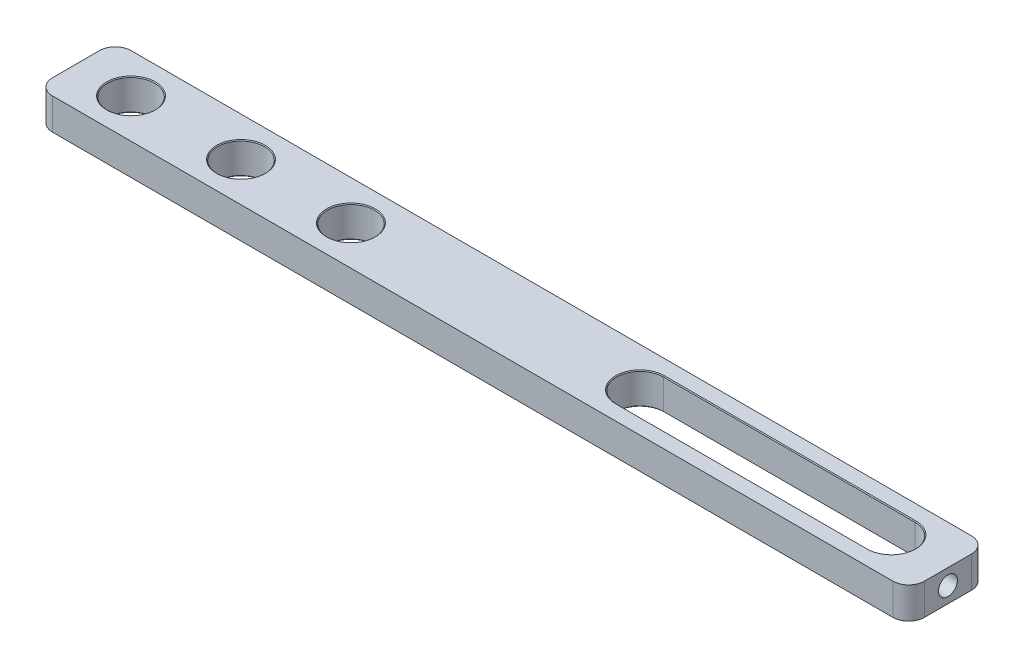
ISO-10303-21;
HEADER;
FILE_DESCRIPTION(('STEP AP214'),'2;1');
FILE_NAME('part.step','',(''),(''),'','','');
FILE_SCHEMA(('AUTOMOTIVE_DESIGN { 1 0 10303 214 1 1 1 1 }'));
ENDSEC;
DATA;
#1=APPLICATION_CONTEXT('core data for automotive mechanical design processes');
#2=APPLICATION_PROTOCOL_DEFINITION('international standard','automotive_design',2000,#1);
#3=PRODUCT_CONTEXT('',#1,'mechanical');
#4=PRODUCT('Part','Part','',(#3));
#5=PRODUCT_RELATED_PRODUCT_CATEGORY('part','',(#4));
#6=PRODUCT_DEFINITION_FORMATION('','',#4);
#7=PRODUCT_DEFINITION_CONTEXT('part definition',#1,'design');
#8=PRODUCT_DEFINITION('design','',#6,#7);
#9=PRODUCT_DEFINITION_SHAPE('','',#8);
#10=(LENGTH_UNIT() NAMED_UNIT(*) SI_UNIT(.MILLI.,.METRE.));
#11=(NAMED_UNIT(*) PLANE_ANGLE_UNIT() SI_UNIT($,.RADIAN.));
#12=(NAMED_UNIT(*) SI_UNIT($,.STERADIAN.) SOLID_ANGLE_UNIT());
#13=UNCERTAINTY_MEASURE_WITH_UNIT(LENGTH_MEASURE(1.E-05),#10,'distance_accuracy_value','');
#14=(GEOMETRIC_REPRESENTATION_CONTEXT(3) GLOBAL_UNCERTAINTY_ASSIGNED_CONTEXT((#13)) GLOBAL_UNIT_ASSIGNED_CONTEXT((#10,
#11,#12)) REPRESENTATION_CONTEXT('',''));
#15=CARTESIAN_POINT('',(0.,0.,0.));
#16=DIRECTION('',(0.,0.,1.));
#17=DIRECTION('',(1.,0.,0.));
#18=AXIS2_PLACEMENT_3D('',#15,#16,#17);
#19=CARTESIAN_POINT('',(-277.5,20.,25.0000000000001));
#20=DIRECTION('',(1.,0.,0.));
#21=DIRECTION('',(0.,0.,-1.));
#22=AXIS2_PLACEMENT_3D('',#19,#20,#21);
#23=PLANE('',#22);
#24=DIRECTION('',(0.,0.,1.));
#25=VECTOR('',#24,1.);
#26=CARTESIAN_POINT('',(-277.5,20.,25.0000000000001));
#27=LINE('',#26,#25);
#28=CARTESIAN_POINT('',(-277.5,20.,-15.));
#29=VERTEX_POINT('',#28);
#30=CARTESIAN_POINT('',(-277.5,20.,15.0000000000001));
#31=VERTEX_POINT('',#30);
#32=EDGE_CURVE('E171',#29,#31,#27,.T.);
#33=ORIENTED_EDGE('',*,*,#32,.F.);
#34=DIRECTION('',(0.,-1.,0.));
#35=VECTOR('',#34,1.);
#36=CARTESIAN_POINT('',(-277.5,20.,-15.));
#37=LINE('',#36,#35);
#38=CARTESIAN_POINT('',(-277.5,0.,-15.));
#39=VERTEX_POINT('',#38);
#40=EDGE_CURVE('E156',#29,#39,#37,.T.);
#41=ORIENTED_EDGE('',*,*,#40,.T.);
#42=DIRECTION('',(0.,0.,1.));
#43=VECTOR('',#42,1.);
#44=CARTESIAN_POINT('',(-277.5,0.,25.0000000000001));
#45=LINE('',#44,#43);
#46=CARTESIAN_POINT('',(-277.5,0.,15.0000000000001));
#47=VERTEX_POINT('',#46);
#48=EDGE_CURVE('E168',#39,#47,#45,.T.);
#49=ORIENTED_EDGE('',*,*,#48,.T.);
#50=DIRECTION('',(0.,-1.,0.));
#51=VECTOR('',#50,1.);
#52=CARTESIAN_POINT('',(-277.5,20.,15.0000000000001));
#53=LINE('',#52,#51);
#54=EDGE_CURVE('E173',#47,#31,#53,.F.);
#55=ORIENTED_EDGE('',*,*,#54,.T.);
#56=EDGE_LOOP('',(#33,#41,#49,#55));
#57=FACE_BOUND('',#56,.T.);
#58=ADVANCED_FACE('F35',(#57),#23,.F.);
#59=CARTESIAN_POINT('',(277.5,20.,25.));
#60=DIRECTION('',(0.,0.,-1.));
#61=DIRECTION('',(-1.,0.,0.));
#62=AXIS2_PLACEMENT_3D('',#59,#60,#61);
#63=PLANE('',#62);
#64=DIRECTION('',(1.,0.,0.));
#65=VECTOR('',#64,1.);
#66=CARTESIAN_POINT('',(277.5,20.,25.));
#67=LINE('',#66,#65);
#68=CARTESIAN_POINT('',(-267.5,20.,25.0000000000001));
#69=VERTEX_POINT('',#68);
#70=CARTESIAN_POINT('',(267.5,20.,25.));
#71=VERTEX_POINT('',#70);
#72=EDGE_CURVE('E342',#69,#71,#67,.T.);
#73=ORIENTED_EDGE('',*,*,#72,.F.);
#74=DIRECTION('',(0.,-1.,0.));
#75=VECTOR('',#74,1.);
#76=CARTESIAN_POINT('',(-267.5,20.,25.0000000000001));
#77=LINE('',#76,#75);
#78=CARTESIAN_POINT('',(-267.5,0.,25.0000000000001));
#79=VERTEX_POINT('',#78);
#80=EDGE_CURVE('E211',#69,#79,#77,.T.);
#81=ORIENTED_EDGE('',*,*,#80,.T.);
#82=DIRECTION('',(1.,0.,0.));
#83=VECTOR('',#82,1.);
#84=CARTESIAN_POINT('',(277.5,0.,25.));
#85=LINE('',#84,#83);
#86=CARTESIAN_POINT('',(267.5,0.,25.));
#87=VERTEX_POINT('',#86);
#88=EDGE_CURVE('E177',#79,#87,#85,.T.);
#89=ORIENTED_EDGE('',*,*,#88,.T.);
#90=DIRECTION('',(0.,-1.,0.));
#91=VECTOR('',#90,1.);
#92=CARTESIAN_POINT('',(267.5,20.,25.));
#93=LINE('',#92,#91);
#94=EDGE_CURVE('E209',#87,#71,#93,.F.);
#95=ORIENTED_EDGE('',*,*,#94,.T.);
#96=EDGE_LOOP('',(#73,#81,#89,#95));
#97=FACE_BOUND('',#96,.T.);
#98=ADVANCED_FACE('F367',(#97),#63,.F.);
#99=CARTESIAN_POINT('',(277.5,20.,25.));
#100=DIRECTION('',(-1.,0.,0.));
#101=DIRECTION('',(0.,0.,1.));
#102=AXIS2_PLACEMENT_3D('',#99,#100,#101);
#103=PLANE('',#102);
#104=CARTESIAN_POINT('',(277.5,10.,0.));
#105=DIRECTION('',(1.,0.,0.));
#106=DIRECTION('',(0.,0.,-1.));
#107=AXIS2_PLACEMENT_3D('',#104,#105,#106);
#108=CIRCLE('',#107,6.);
#109=CARTESIAN_POINT('',(277.5,10.,-6.));
#110=VERTEX_POINT('',#109);
#111=EDGE_CURVE('E295',#110,#110,#108,.T.);
#112=ORIENTED_EDGE('',*,*,#111,.F.);
#113=EDGE_LOOP('',(#112));
#114=FACE_BOUND('',#113,.T.);
#115=DIRECTION('',(0.,0.,-1.));
#116=VECTOR('',#115,1.);
#117=CARTESIAN_POINT('',(277.5,0.,25.));
#118=LINE('',#117,#116);
#119=CARTESIAN_POINT('',(277.5,0.,15.));
#120=VERTEX_POINT('',#119);
#121=CARTESIAN_POINT('',(277.5,0.,-15.));
#122=VERTEX_POINT('',#121);
#123=EDGE_CURVE('E181',#120,#122,#118,.T.);
#124=ORIENTED_EDGE('',*,*,#123,.T.);
#125=DIRECTION('',(0.,-1.,0.));
#126=VECTOR('',#125,1.);
#127=CARTESIAN_POINT('',(277.5,20.,-15.));
#128=LINE('',#127,#126);
#129=CARTESIAN_POINT('',(277.5,20.,-15.));
#130=VERTEX_POINT('',#129);
#131=EDGE_CURVE('E217',#122,#130,#128,.F.);
#132=ORIENTED_EDGE('',*,*,#131,.T.);
#133=DIRECTION('',(0.,0.,-1.));
#134=VECTOR('',#133,1.);
#135=CARTESIAN_POINT('',(277.5,20.,25.));
#136=LINE('',#135,#134);
#137=CARTESIAN_POINT('',(277.5,20.,15.));
#138=VERTEX_POINT('',#137);
#139=EDGE_CURVE('E344',#138,#130,#136,.T.);
#140=ORIENTED_EDGE('',*,*,#139,.F.);
#141=DIRECTION('',(0.,-1.,0.));
#142=VECTOR('',#141,1.);
#143=CARTESIAN_POINT('',(277.5,20.,15.));
#144=LINE('',#143,#142);
#145=EDGE_CURVE('E214',#138,#120,#144,.T.);
#146=ORIENTED_EDGE('',*,*,#145,.T.);
#147=EDGE_LOOP('',(#124,#132,#140,#146));
#148=FACE_BOUND('',#147,.T.);
#149=ADVANCED_FACE('F359',(#114,#148),#103,.F.);
#150=CARTESIAN_POINT('',(277.5,20.,-25.));
#151=DIRECTION('',(0.,0.,1.));
#152=DIRECTION('',(1.,0.,0.));
#153=AXIS2_PLACEMENT_3D('',#150,#151,#152);
#154=PLANE('',#153);
#155=DIRECTION('',(-1.,0.,0.));
#156=VECTOR('',#155,1.);
#157=CARTESIAN_POINT('',(277.5,0.,-25.));
#158=LINE('',#157,#156);
#159=CARTESIAN_POINT('',(267.5,0.,-25.));
#160=VERTEX_POINT('',#159);
#161=CARTESIAN_POINT('',(-267.5,0.,-25.));
#162=VERTEX_POINT('',#161);
#163=EDGE_CURVE('E191',#160,#162,#158,.T.);
#164=ORIENTED_EDGE('',*,*,#163,.T.);
#165=DIRECTION('',(0.,-1.,0.));
#166=VECTOR('',#165,1.);
#167=CARTESIAN_POINT('',(-267.5,20.,-25.));
#168=LINE('',#167,#166);
#169=CARTESIAN_POINT('',(-267.5,20.,-25.));
#170=VERTEX_POINT('',#169);
#171=EDGE_CURVE('E157',#162,#170,#168,.F.);
#172=ORIENTED_EDGE('',*,*,#171,.T.);
#173=DIRECTION('',(-1.,0.,0.));
#174=VECTOR('',#173,1.);
#175=CARTESIAN_POINT('',(277.5,20.,-25.));
#176=LINE('',#175,#174);
#177=CARTESIAN_POINT('',(267.5,20.,-25.));
#178=VERTEX_POINT('',#177);
#179=EDGE_CURVE('E186',#178,#170,#176,.T.);
#180=ORIENTED_EDGE('',*,*,#179,.F.);
#181=DIRECTION('',(0.,-1.,0.));
#182=VECTOR('',#181,1.);
#183=CARTESIAN_POINT('',(267.5,20.,-25.));
#184=LINE('',#183,#182);
#185=EDGE_CURVE('E162',#178,#160,#184,.T.);
#186=ORIENTED_EDGE('',*,*,#185,.T.);
#187=EDGE_LOOP('',(#164,#172,#180,#186));
#188=FACE_BOUND('',#187,.T.);
#189=ADVANCED_FACE('F353',(#188),#154,.F.);
#190=CARTESIAN_POINT('',(0.,20.,0.));
#191=DIRECTION('',(0.,1.,0.));
#192=DIRECTION('',(0.,0.,1.));
#193=AXIS2_PLACEMENT_3D('',#190,#191,#192);
#194=PLANE('',#193);
#195=CARTESIAN_POINT('',(-102.5,20.,0.));
#196=DIRECTION('',(0.,1.,0.));
#197=DIRECTION('',(0.,0.,1.));
#198=AXIS2_PLACEMENT_3D('',#195,#196,#197);
#199=CIRCLE('',#198,15.5);
#200=CARTESIAN_POINT('',(-102.5,20.,15.5));
#201=VERTEX_POINT('',#200);
#202=EDGE_CURVE('E240',#201,#201,#199,.F.);
#203=ORIENTED_EDGE('',*,*,#202,.T.);
#204=EDGE_LOOP('',(#203));
#205=FACE_BOUND('',#204,.T.);
#206=CARTESIAN_POINT('',(241.5,20.,0.));
#207=DIRECTION('',(0.,1.,0.));
#208=DIRECTION('',(0.,0.,1.));
#209=AXIS2_PLACEMENT_3D('',#206,#207,#208);
#210=CIRCLE('',#209,15.5);
#211=CARTESIAN_POINT('',(241.5,20.,-15.5));
#212=VERTEX_POINT('',#211);
#213=CARTESIAN_POINT('',(241.5,20.,15.5));
#214=VERTEX_POINT('',#213);
#215=EDGE_CURVE('E235',#212,#214,#210,.F.);
#216=ORIENTED_EDGE('',*,*,#215,.T.);
#217=DIRECTION('',(-1.,0.,0.));
#218=VECTOR('',#217,1.);
#219=CARTESIAN_POINT('',(81.5,20.,15.5));
#220=LINE('',#219,#218);
#221=CARTESIAN_POINT('',(81.5,20.,15.5));
#222=VERTEX_POINT('',#221);
#223=EDGE_CURVE('E237',#214,#222,#220,.T.);
#224=ORIENTED_EDGE('',*,*,#223,.T.);
#225=CARTESIAN_POINT('',(81.5,20.,0.));
#226=DIRECTION('',(0.,1.,0.));
#227=DIRECTION('',(0.,0.,1.));
#228=AXIS2_PLACEMENT_3D('',#225,#226,#227);
#229=CIRCLE('',#228,15.5);
#230=CARTESIAN_POINT('',(81.5,20.,-15.5));
#231=VERTEX_POINT('',#230);
#232=EDGE_CURVE('E233',#222,#231,#229,.F.);
#233=ORIENTED_EDGE('',*,*,#232,.T.);
#234=DIRECTION('',(1.,0.,0.));
#235=VECTOR('',#234,1.);
#236=CARTESIAN_POINT('',(241.5,20.,-15.5));
#237=LINE('',#236,#235);
#238=EDGE_CURVE('E231',#231,#212,#237,.T.);
#239=ORIENTED_EDGE('',*,*,#238,.T.);
#240=EDGE_LOOP('',(#216,#224,#233,#239));
#241=FACE_BOUND('',#240,.T.);
#242=CARTESIAN_POINT('',(-172.5,20.,0.));
#243=DIRECTION('',(0.,1.,0.));
#244=DIRECTION('',(0.,0.,1.));
#245=AXIS2_PLACEMENT_3D('',#242,#243,#244);
#246=CIRCLE('',#245,15.5);
#247=CARTESIAN_POINT('',(-172.5,20.,15.5));
#248=VERTEX_POINT('',#247);
#249=EDGE_CURVE('E228',#248,#248,#246,.F.);
#250=ORIENTED_EDGE('',*,*,#249,.T.);
#251=EDGE_LOOP('',(#250));
#252=FACE_BOUND('',#251,.T.);
#253=CARTESIAN_POINT('',(-242.5,20.,0.));
#254=DIRECTION('',(0.,1.,0.));
#255=DIRECTION('',(0.,0.,1.));
#256=AXIS2_PLACEMENT_3D('',#253,#254,#255);
#257=CIRCLE('',#256,15.5);
#258=CARTESIAN_POINT('',(-242.5,20.,15.5));
#259=VERTEX_POINT('',#258);
#260=EDGE_CURVE('E225',#259,#259,#257,.F.);
#261=ORIENTED_EDGE('',*,*,#260,.T.);
#262=EDGE_LOOP('',(#261));
#263=FACE_BOUND('',#262,.T.);
#264=ORIENTED_EDGE('',*,*,#179,.T.);
#265=CARTESIAN_POINT('',(-267.5,20.,-15.));
#266=DIRECTION('',(0.,1.,0.));
#267=DIRECTION('',(0.,0.,1.));
#268=AXIS2_PLACEMENT_3D('',#265,#266,#267);
#269=CIRCLE('',#268,10.);
#270=EDGE_CURVE('E207',#170,#29,#269,.T.);
#271=ORIENTED_EDGE('',*,*,#270,.T.);
#272=ORIENTED_EDGE('',*,*,#32,.T.);
#273=CARTESIAN_POINT('',(-267.5,20.,15.0000000000001));
#274=DIRECTION('',(0.,1.,0.));
#275=DIRECTION('',(0.,0.,1.));
#276=AXIS2_PLACEMENT_3D('',#273,#274,#275);
#277=CIRCLE('',#276,10.);
#278=EDGE_CURVE('E205',#31,#69,#277,.T.);
#279=ORIENTED_EDGE('',*,*,#278,.T.);
#280=ORIENTED_EDGE('',*,*,#72,.T.);
#281=CARTESIAN_POINT('',(267.5,20.,15.));
#282=DIRECTION('',(0.,1.,0.));
#283=DIRECTION('',(0.,0.,1.));
#284=AXIS2_PLACEMENT_3D('',#281,#282,#283);
#285=CIRCLE('',#284,10.);
#286=EDGE_CURVE('E201',#71,#138,#285,.T.);
#287=ORIENTED_EDGE('',*,*,#286,.T.);
#288=ORIENTED_EDGE('',*,*,#139,.T.);
#289=CARTESIAN_POINT('',(267.5,20.,-15.));
#290=DIRECTION('',(0.,1.,0.));
#291=DIRECTION('',(0.,0.,1.));
#292=AXIS2_PLACEMENT_3D('',#289,#290,#291);
#293=CIRCLE('',#292,10.);
#294=EDGE_CURVE('E203',#130,#178,#293,.T.);
#295=ORIENTED_EDGE('',*,*,#294,.T.);
#296=EDGE_LOOP('',(#264,#271,#272,#279,#280,#287,#288,#295));
#297=FACE_BOUND('',#296,.T.);
#298=ADVANCED_FACE('F316',(#205,#241,#252,#263,#297),#194,.T.);
#299=CARTESIAN_POINT('',(0.,0.,0.));
#300=DIRECTION('',(0.,1.,0.));
#301=DIRECTION('',(0.,0.,1.));
#302=AXIS2_PLACEMENT_3D('',#299,#300,#301);
#303=PLANE('',#302);
#304=CARTESIAN_POINT('',(-102.5,0.,0.));
#305=DIRECTION('',(0.,1.,0.));
#306=DIRECTION('',(0.,0.,1.));
#307=AXIS2_PLACEMENT_3D('',#304,#305,#306);
#308=CIRCLE('',#307,15.4999999999998);
#309=CARTESIAN_POINT('',(-102.5,0.,15.4999999999998));
#310=VERTEX_POINT('',#309);
#311=EDGE_CURVE('E258',#310,#310,#308,.T.);
#312=ORIENTED_EDGE('',*,*,#311,.T.);
#313=EDGE_LOOP('',(#312));
#314=FACE_BOUND('',#313,.T.);
#315=CARTESIAN_POINT('',(81.5,0.,0.));
#316=DIRECTION('',(0.,1.,0.));
#317=DIRECTION('',(0.,0.,1.));
#318=AXIS2_PLACEMENT_3D('',#315,#316,#317);
#319=CIRCLE('',#318,15.5);
#320=CARTESIAN_POINT('',(81.5,0.,-15.5));
#321=VERTEX_POINT('',#320);
#322=CARTESIAN_POINT('',(81.5,0.,15.5));
#323=VERTEX_POINT('',#322);
#324=EDGE_CURVE('E251',#321,#323,#319,.T.);
#325=ORIENTED_EDGE('',*,*,#324,.T.);
#326=DIRECTION('',(1.,0.,0.));
#327=VECTOR('',#326,1.);
#328=CARTESIAN_POINT('',(0.,0.,15.5));
#329=LINE('',#328,#327);
#330=CARTESIAN_POINT('',(241.5,0.,15.5));
#331=VERTEX_POINT('',#330);
#332=EDGE_CURVE('E255',#323,#331,#329,.T.);
#333=ORIENTED_EDGE('',*,*,#332,.T.);
#334=CARTESIAN_POINT('',(241.5,0.,0.));
#335=DIRECTION('',(0.,1.,0.));
#336=DIRECTION('',(0.,0.,1.));
#337=AXIS2_PLACEMENT_3D('',#334,#335,#336);
#338=CIRCLE('',#337,15.5);
#339=CARTESIAN_POINT('',(241.5,0.,-15.5));
#340=VERTEX_POINT('',#339);
#341=EDGE_CURVE('E253',#331,#340,#338,.T.);
#342=ORIENTED_EDGE('',*,*,#341,.T.);
#343=DIRECTION('',(-1.,0.,0.));
#344=VECTOR('',#343,1.);
#345=CARTESIAN_POINT('',(0.,0.,-15.5));
#346=LINE('',#345,#344);
#347=EDGE_CURVE('E249',#340,#321,#346,.T.);
#348=ORIENTED_EDGE('',*,*,#347,.T.);
#349=EDGE_LOOP('',(#325,#333,#342,#348));
#350=FACE_BOUND('',#349,.T.);
#351=CARTESIAN_POINT('',(-172.5,0.,0.));
#352=DIRECTION('',(0.,1.,0.));
#353=DIRECTION('',(0.,0.,1.));
#354=AXIS2_PLACEMENT_3D('',#351,#352,#353);
#355=CIRCLE('',#354,15.4999999999998);
#356=CARTESIAN_POINT('',(-172.5,0.,15.4999999999998));
#357=VERTEX_POINT('',#356);
#358=EDGE_CURVE('E246',#357,#357,#355,.T.);
#359=ORIENTED_EDGE('',*,*,#358,.T.);
#360=EDGE_LOOP('',(#359));
#361=FACE_BOUND('',#360,.T.);
#362=CARTESIAN_POINT('',(-242.5,0.,0.));
#363=DIRECTION('',(0.,1.,0.));
#364=DIRECTION('',(0.,0.,1.));
#365=AXIS2_PLACEMENT_3D('',#362,#363,#364);
#366=CIRCLE('',#365,15.4999999999998);
#367=CARTESIAN_POINT('',(-242.5,0.,15.4999999999998));
#368=VERTEX_POINT('',#367);
#369=EDGE_CURVE('E243',#368,#368,#366,.T.);
#370=ORIENTED_EDGE('',*,*,#369,.T.);
#371=EDGE_LOOP('',(#370));
#372=FACE_BOUND('',#371,.T.);
#373=ORIENTED_EDGE('',*,*,#48,.F.);
#374=CARTESIAN_POINT('',(-267.5,0.,-15.));
#375=DIRECTION('',(0.,1.,0.));
#376=DIRECTION('',(0.,0.,1.));
#377=AXIS2_PLACEMENT_3D('',#374,#375,#376);
#378=CIRCLE('',#377,10.);
#379=EDGE_CURVE('E152',#39,#162,#378,.F.);
#380=ORIENTED_EDGE('',*,*,#379,.T.);
#381=ORIENTED_EDGE('',*,*,#163,.F.);
#382=CARTESIAN_POINT('',(267.5,0.,-15.));
#383=DIRECTION('',(0.,1.,0.));
#384=DIRECTION('',(0.,0.,1.));
#385=AXIS2_PLACEMENT_3D('',#382,#383,#384);
#386=CIRCLE('',#385,10.);
#387=EDGE_CURVE('E195',#160,#122,#386,.F.);
#388=ORIENTED_EDGE('',*,*,#387,.T.);
#389=ORIENTED_EDGE('',*,*,#123,.F.);
#390=CARTESIAN_POINT('',(267.5,0.,15.));
#391=DIRECTION('',(0.,1.,0.));
#392=DIRECTION('',(0.,0.,1.));
#393=AXIS2_PLACEMENT_3D('',#390,#391,#392);
#394=CIRCLE('',#393,10.);
#395=EDGE_CURVE('E172',#120,#87,#394,.F.);
#396=ORIENTED_EDGE('',*,*,#395,.T.);
#397=ORIENTED_EDGE('',*,*,#88,.F.);
#398=CARTESIAN_POINT('',(-267.5,0.,15.0000000000001));
#399=DIRECTION('',(0.,1.,0.));
#400=DIRECTION('',(0.,0.,1.));
#401=AXIS2_PLACEMENT_3D('',#398,#399,#400);
#402=CIRCLE('',#401,10.);
#403=EDGE_CURVE('E163',#79,#47,#402,.F.);
#404=ORIENTED_EDGE('',*,*,#403,.T.);
#405=EDGE_LOOP('',(#373,#380,#381,#388,#389,#396,#397,#404));
#406=FACE_BOUND('',#405,.T.);
#407=ADVANCED_FACE('F175',(#314,#350,#361,#372,#406),#303,.F.);
#408=CARTESIAN_POINT('',(81.5,0.,0.));
#409=DIRECTION('',(0.,1.,0.));
#410=DIRECTION('',(0.,0.,1.));
#411=AXIS2_PLACEMENT_3D('',#408,#409,#410);
#412=CYLINDRICAL_SURFACE('',#411,15.);
#413=DIRECTION('',(0.,1.,0.));
#414=VECTOR('',#413,1.);
#415=CARTESIAN_POINT('',(81.5,0.,15.));
#416=LINE('',#415,#414);
#417=CARTESIAN_POINT('',(81.5,0.5,15.));
#418=VERTEX_POINT('',#417);
#419=CARTESIAN_POINT('',(81.5,19.4999999999999,15.));
#420=VERTEX_POINT('',#419);
#421=EDGE_CURVE('E333',#418,#420,#416,.T.);
#422=ORIENTED_EDGE('',*,*,#421,.F.);
#423=CARTESIAN_POINT('',(81.5,0.5,0.));
#424=DIRECTION('',(0.,1.,0.));
#425=DIRECTION('',(0.,0.,1.));
#426=AXIS2_PLACEMENT_3D('',#423,#424,#425);
#427=CIRCLE('',#426,15.);
#428=CARTESIAN_POINT('',(81.5,0.5,-15.));
#429=VERTEX_POINT('',#428);
#430=EDGE_CURVE('E59',#418,#429,#427,.F.);
#431=ORIENTED_EDGE('',*,*,#430,.T.);
#432=DIRECTION('',(0.,1.,0.));
#433=VECTOR('',#432,1.);
#434=CARTESIAN_POINT('',(81.5,0.,-15.));
#435=LINE('',#434,#433);
#436=CARTESIAN_POINT('',(81.5,19.4999999999999,-15.));
#437=VERTEX_POINT('',#436);
#438=EDGE_CURVE('E178',#429,#437,#435,.T.);
#439=ORIENTED_EDGE('',*,*,#438,.T.);
#440=CARTESIAN_POINT('',(81.5,19.4999999999999,0.));
#441=DIRECTION('',(0.,1.,0.));
#442=DIRECTION('',(0.,0.,1.));
#443=AXIS2_PLACEMENT_3D('',#440,#441,#442);
#444=CIRCLE('',#443,15.);
#445=EDGE_CURVE('E271',#437,#420,#444,.T.);
#446=ORIENTED_EDGE('',*,*,#445,.T.);
#447=EDGE_LOOP('',(#422,#431,#439,#446));
#448=FACE_BOUND('',#447,.T.);
#449=ADVANCED_FACE('F395',(#448),#412,.F.);
#450=CARTESIAN_POINT('',(81.5,0.,-15.));
#451=DIRECTION('',(0.,0.,-1.));
#452=DIRECTION('',(-1.,0.,0.));
#453=AXIS2_PLACEMENT_3D('',#450,#451,#452);
#454=PLANE('',#453);
#455=ORIENTED_EDGE('',*,*,#438,.F.);
#456=DIRECTION('',(1.,0.,0.));
#457=VECTOR('',#456,1.);
#458=CARTESIAN_POINT('',(81.5,0.5,-15.));
#459=LINE('',#458,#457);
#460=CARTESIAN_POINT('',(241.5,0.5,-15.));
#461=VERTEX_POINT('',#460);
#462=EDGE_CURVE('E275',#429,#461,#459,.T.);
#463=ORIENTED_EDGE('',*,*,#462,.T.);
#464=DIRECTION('',(0.,1.,0.));
#465=VECTOR('',#464,1.);
#466=CARTESIAN_POINT('',(241.5,0.,-15.));
#467=LINE('',#466,#465);
#468=CARTESIAN_POINT('',(241.5,19.4999999999999,-15.));
#469=VERTEX_POINT('',#468);
#470=EDGE_CURVE('E183',#461,#469,#467,.T.);
#471=ORIENTED_EDGE('',*,*,#470,.T.);
#472=DIRECTION('',(-1.,0.,0.));
#473=VECTOR('',#472,1.);
#474=CARTESIAN_POINT('',(81.5,19.4999999999999,-15.));
#475=LINE('',#474,#473);
#476=EDGE_CURVE('E52',#469,#437,#475,.T.);
#477=ORIENTED_EDGE('',*,*,#476,.T.);
#478=EDGE_LOOP('',(#455,#463,#471,#477));
#479=FACE_BOUND('',#478,.T.);
#480=ADVANCED_FACE('F402',(#479),#454,.F.);
#481=CARTESIAN_POINT('',(241.5,0.,0.));
#482=DIRECTION('',(0.,1.,0.));
#483=DIRECTION('',(0.,0.,1.));
#484=AXIS2_PLACEMENT_3D('',#481,#482,#483);
#485=CYLINDRICAL_SURFACE('',#484,15.);
#486=CARTESIAN_POINT('',(255.247727084868,10.,-6.));
#487=CARTESIAN_POINT('',(255.247728326063,9.83923401517262,-5.99999875640954));
#488=CARTESIAN_POINT('',(255.250556559433,9.67841889398453,-5.99352975206176));
#489=CARTESIAN_POINT('',(255.261778539965,9.35795117464871,-5.96771672897828));
#490=CARTESIAN_POINT('',(255.270175693528,9.19829934853127,-5.94836482999676));
#491=CARTESIAN_POINT('',(255.292275435752,8.88109857382314,-5.89694174030869));
#492=CARTESIAN_POINT('',(255.305988595142,8.72355446618763,-5.86484520413903));
#493=CARTESIAN_POINT('',(255.338274477616,8.41195939472605,-5.78825391878448));
#494=CARTESIAN_POINT('',(255.356849219474,8.25790991098928,-5.74375401859824));
#495=CARTESIAN_POINT('',(255.398184993412,7.95501673487177,-5.64299599700453));
#496=CARTESIAN_POINT('',(255.420928031892,7.80615382042035,-5.58678827846126));
#497=CARTESIAN_POINT('',(255.469977180975,7.51382549408584,-5.46298123967255));
#498=CARTESIAN_POINT('',(255.496284646722,7.37036216168083,-5.39537758446073));
#499=CARTESIAN_POINT('',(255.579417328674,6.94951883690819,-5.17633416323045));
#500=CARTESIAN_POINT('',(255.640507474891,6.6813068922858,-5.00853494267613));
#501=CARTESIAN_POINT('',(255.771040522157,6.16214074541745,-4.62391158998239));
#502=CARTESIAN_POINT('',(255.840752300891,5.91280294861273,-4.40499626343135));
#503=CARTESIAN_POINT('',(255.943970865105,5.56826093542371,-4.04810209892429));
#504=CARTESIAN_POINT('',(255.978174859803,5.45826002448254,-3.9242905158216));
#505=CARTESIAN_POINT('',(256.045267398377,5.24872106266711,-3.66779743847792));
#506=CARTESIAN_POINT('',(256.078156393034,5.14917940697895,-3.53511902618019));
#507=CARTESIAN_POINT('',(256.143044861531,4.95745839424805,-3.25615691069843));
#508=CARTESIAN_POINT('',(256.174956360716,4.86573180063249,-3.10954147620186));
#509=CARTESIAN_POINT('',(256.235535593301,4.69506147775559,-2.80847871906791));
#510=CARTESIAN_POINT('',(256.264204561765,4.61611287644835,-2.65403441109174));
#511=CARTESIAN_POINT('',(256.317486175533,4.47167255195183,-2.33831705380735));
#512=CARTESIAN_POINT('',(256.342099264458,4.40617935685654,-2.1770447537532));
#513=CARTESIAN_POINT('',(256.386545668803,4.28929369296097,-1.8488303602226));
#514=CARTESIAN_POINT('',(256.406379289597,4.23790032325498,-1.68188862975968));
#515=CARTESIAN_POINT('',(256.439837101563,4.15190429236887,-1.35182764993868));
#516=CARTESIAN_POINT('',(256.453715330561,4.11660945519775,-1.18891435676812));
#517=CARTESIAN_POINT('',(256.476210416057,4.05966629236898,-0.860364736698413));
#518=CARTESIAN_POINT('',(256.484827583545,4.03801716008866,-0.694728571347246));
#519=CARTESIAN_POINT('',(256.496552435937,4.00860892847468,-0.36208368084693));
#520=CARTESIAN_POINT('',(256.499661790997,4.00084561847808,-0.195075387211749));
#521=CARTESIAN_POINT('',(256.500285827953,3.99928533474853,0.139014166426376));
#522=CARTESIAN_POINT('',(256.497800706536,4.00548787001281,0.306095423657629));
#523=CARTESIAN_POINT('',(256.487605681172,4.0310428513216,0.629581360842822));
#524=CARTESIAN_POINT('',(256.480198515574,4.04963352107505,0.786056489987582));
#525=CARTESIAN_POINT('',(256.460655881646,4.0990052897818,1.09682374164984));
#526=CARTESIAN_POINT('',(256.448518870947,4.12979036530118,1.25111513504043));
#527=CARTESIAN_POINT('',(256.419826551669,4.2032452361302,1.55636446880933));
#528=CARTESIAN_POINT('',(256.403272682441,4.2459111599482,1.7073234778125));
#529=CARTESIAN_POINT('',(256.366146290655,4.34276525361738,2.00504692560526));
#530=CARTESIAN_POINT('',(256.345572241859,4.39695780017572,2.15180974700395));
#531=CARTESIAN_POINT('',(256.300573391341,4.51728775479079,2.44232275401437));
#532=CARTESIAN_POINT('',(256.276096560975,4.58358862223754,2.58599723661978));
#533=CARTESIAN_POINT('',(256.224106734326,4.72707115235082,2.86725918170996));
#534=CARTESIAN_POINT('',(256.196592627269,4.80425679861444,3.00484439132129));
#535=CARTESIAN_POINT('',(256.110461894182,5.05131162554404,3.40726603321778));
#536=CARTESIAN_POINT('',(256.04822604577,5.23675812276061,3.66195901653257));
#537=CARTESIAN_POINT('',(255.915633004976,5.65800842353411,4.15437949370372));
#538=CARTESIAN_POINT('',(255.845010878286,5.89631904719473,4.38989525780835));
#539=CARTESIAN_POINT('',(255.741388992511,6.28080289564828,4.71121812404964));
#540=CARTESIAN_POINT('',(255.70721104903,6.41356700600879,4.81305918105095));
#541=CARTESIAN_POINT('',(255.640566893619,6.68741028814084,5.0054684951315));
#542=CARTESIAN_POINT('',(255.608100055177,6.82848637589201,5.09604089492642));
#543=CARTESIAN_POINT('',(255.544920771619,7.12233202080631,5.2677144885335));
#544=CARTESIAN_POINT('',(255.514285655624,7.27532121081766,5.34846830074844));
#545=CARTESIAN_POINT('',(255.456825248756,7.58823593130377,5.49666677344655));
#546=CARTESIAN_POINT('',(255.429998412706,7.74815861399036,5.56411683616808));
#547=CARTESIAN_POINT('',(255.381072617042,8.07384284263974,5.68507549818267));
#548=CARTESIAN_POINT('',(255.358972165123,8.23960252632122,5.73858849912391));
#549=CARTESIAN_POINT('',(255.320297745104,8.57574949288024,5.83111405710325));
#550=CARTESIAN_POINT('',(255.303723332125,8.74613640204421,5.87012778144672));
#551=CARTESIAN_POINT('',(255.277560295714,9.07962449706724,5.93126188446899));
#552=CARTESIAN_POINT('',(255.267606771578,9.24253490130638,5.95426866502425));
#553=CARTESIAN_POINT('',(255.253479952936,9.5699405808917,5.98682783069773));
#554=CARTESIAN_POINT('',(255.249306315779,9.73443576170469,5.99638101339171));
#555=CARTESIAN_POINT('',(255.246889190844,10.0636550027545,6.00192022727181));
#556=CARTESIAN_POINT('',(255.248644188017,10.2283789937653,5.99790972463034));
#557=CARTESIAN_POINT('',(255.258017886343,10.5567696976515,5.97637695694085));
#558=CARTESIAN_POINT('',(255.265636439669,10.7204364370767,5.95885503253298));
#559=CARTESIAN_POINT('',(255.285867846956,11.036115067141,5.91189113707813));
#560=CARTESIAN_POINT('',(255.298169860625,11.1882578347525,5.88318889041452));
#561=CARTESIAN_POINT('',(255.327368930822,11.4895012126947,5.81422990546568));
#562=CARTESIAN_POINT('',(255.34426747466,11.6386008215261,5.77396942701893));
#563=CARTESIAN_POINT('',(255.382155687508,11.9327492391615,5.68227161206331));
#564=CARTESIAN_POINT('',(255.403144556771,12.0777988335025,5.6308364602182));
#565=CARTESIAN_POINT('',(255.448634285342,12.3631002504996,5.5171864735025));
#566=CARTESIAN_POINT('',(255.473136491437,12.5033502076278,5.45496750289055));
#567=CARTESIAN_POINT('',(255.526036805412,12.7837789656608,5.31751145640008));
#568=CARTESIAN_POINT('',(255.554551887834,12.9237285166001,5.24185178482307));
#569=CARTESIAN_POINT('',(255.613900409164,13.1968682526732,5.07988717682862));
#570=CARTESIAN_POINT('',(255.644734640495,13.3300561011461,4.99357859530798));
#571=CARTESIAN_POINT('',(255.707918040857,13.5889694133806,4.81086355761932));
#572=CARTESIAN_POINT('',(255.740267484746,13.7146935137701,4.71445526541628));
#573=CARTESIAN_POINT('',(255.805671137935,13.9580251601433,4.51210358125893));
#574=CARTESIAN_POINT('',(255.838725374819,14.0756323876833,4.40615981558121));
#575=CARTESIAN_POINT('',(255.907189808366,14.3105291021025,4.17710486838273));
#576=CARTESIAN_POINT('',(255.942592979753,14.427148536304,4.05330323673503));
#577=CARTESIAN_POINT('',(256.012313656168,14.6495589225396,3.79611595891185));
#578=CARTESIAN_POINT('',(256.046631501969,14.7553532972389,3.66273336488668));
#579=CARTESIAN_POINT('',(256.11327921354,14.9554856438958,3.38706145939603));
#580=CARTESIAN_POINT('',(256.145608154752,15.0498183073508,3.24476806677011));
#581=CARTESIAN_POINT('',(256.207363334958,15.2262186366538,2.95225256674958));
#582=CARTESIAN_POINT('',(256.236790819725,15.3082915742137,2.80203390506011));
#583=CARTESIAN_POINT('',(256.291947355579,15.4595484239955,2.49453307495679));
#584=CARTESIAN_POINT('',(256.317675453452,15.5287290156244,2.33724909968869));
#585=CARTESIAN_POINT('',(256.364679759897,15.6534984462703,2.01680521759423));
#586=CARTESIAN_POINT('',(256.385957833889,15.7090929821241,1.85364780662783));
#587=CARTESIAN_POINT('',(256.42344716398,15.8061415480013,1.52264805192432));
#588=CARTESIAN_POINT('',(256.439659599453,15.8475988696325,1.35480680859647));
#589=CARTESIAN_POINT('',(256.46653506105,15.9159243726373,1.01574606559106));
#590=CARTESIAN_POINT('',(256.477198462348,15.9427935403297,0.844526795116485));
#591=CARTESIAN_POINT('',(256.492145811743,15.9803603245855,0.511396994408887));
#592=CARTESIAN_POINT('',(256.496800834273,15.9919992841513,0.349608608417647));
#593=CARTESIAN_POINT('',(256.500853255906,16.002134736856,0.0255568035504914));
#594=CARTESIAN_POINT('',(256.500250847209,16.0006317104365,-0.136706597743128));
#595=CARTESIAN_POINT('',(256.49380531405,15.9845009548212,-0.460449157871507));
#596=CARTESIAN_POINT('',(256.487962943395,15.9698751134392,-0.621928426150296));
#597=CARTESIAN_POINT('',(256.471197081246,15.9276569576261,-0.942913616351041));
#598=CARTESIAN_POINT('',(256.460273608706,15.9000646915662,-1.10241954563224));
#599=CARTESIAN_POINT('',(256.434051456014,15.8332499375044,-1.41340092731344));
#600=CARTESIAN_POINT('',(256.418898762439,15.7944141267664,-1.56497209153591));
#601=CARTESIAN_POINT('',(256.384465275277,15.7051731686152,-1.86423948532529));
#602=CARTESIAN_POINT('',(256.365183122398,15.6547642112801,-2.01193442094207));
#603=CARTESIAN_POINT('',(256.322962279179,15.542823804849,-2.302462712288));
#604=CARTESIAN_POINT('',(256.300024413987,15.4812948652792,-2.44529715629449));
#605=CARTESIAN_POINT('',(256.25101793361,15.3475602832894,-2.72537941223682));
#606=CARTESIAN_POINT('',(256.224948128545,15.2753505806317,-2.86262507421092));
#607=CARTESIAN_POINT('',(256.169082691946,15.1173900536164,-3.13662388518831));
#608=CARTESIAN_POINT('',(256.139173840724,15.0311844486831,-3.27309180108705));
#609=CARTESIAN_POINT('',(256.077325390692,14.848280483108,-3.53838180351729));
#610=CARTESIAN_POINT('',(256.045385092248,14.7515784993095,-3.66720122604104));
#611=CARTESIAN_POINT('',(255.980251425724,14.5482911380891,-3.91649343612946));
#612=CARTESIAN_POINT('',(255.947057809883,14.4417038003692,-4.03696455988818));
#613=CARTESIAN_POINT('',(255.880230031478,14.2192732973765,-4.26890539529755));
#614=CARTESIAN_POINT('',(255.846595855458,14.1034298488433,-4.38037483126384));
#615=CARTESIAN_POINT('',(255.777635023109,13.8556306822931,-4.6003520349242));
#616=CARTESIAN_POINT('',(255.742333187271,13.723120983084,-4.7082445488358));
#617=CARTESIAN_POINT('',(255.673189975584,13.4491838502205,-4.91246454048885));
#618=CARTESIAN_POINT('',(255.639348110297,13.3077594448768,-5.0087959135827));
#619=CARTESIAN_POINT('',(255.574101401705,13.0166957341013,-5.18930521843518));
#620=CARTESIAN_POINT('',(255.542698010642,12.8670516226005,-5.27347593316246));
#621=CARTESIAN_POINT('',(255.483353216029,12.5606133792459,-5.42888140715686));
#622=CARTESIAN_POINT('',(255.455410129663,12.4038227740358,-5.5001224622914));
#623=CARTESIAN_POINT('',(255.406206088881,12.0983830122752,-5.62329338728313));
#624=CARTESIAN_POINT('',(255.384571005947,11.9502600482609,-5.67638059374282));
#625=CARTESIAN_POINT('',(255.345570471799,11.6498436148679,-5.77085722264899));
#626=CARTESIAN_POINT('',(255.328203085373,11.4975520707046,-5.81225194839873));
#627=CARTESIAN_POINT('',(255.298294102034,11.1900764289222,-5.88290316620707));
#628=CARTESIAN_POINT('',(255.285741826659,11.0348995415231,-5.91218652902551));
#629=CARTESIAN_POINT('',(255.26581523958,10.7224555155056,-5.95843701087142));
#630=CARTESIAN_POINT('',(255.258437922481,10.5651896442468,-5.97541127868373));
#631=CARTESIAN_POINT('',(255.251755327731,10.3396747669712,-5.99076318011059));
#632=CARTESIAN_POINT('',(255.250245947937,10.2718004455423,-5.99422579943118));
#633=CARTESIAN_POINT('',(255.248231527262,10.1359536826385,-5.99884455686221));
#634=CARTESIAN_POINT('',(255.247726560018,10.0679812343349,-6.00000052586257));
#635=CARTESIAN_POINT('',(255.247727084868,10.,-6.));
#636=B_SPLINE_CURVE_WITH_KNOTS('',3,(#486,#487,#488,#489,#490,#491,#492,#493,#494,#495,#496,
#497,#498,#499,#500,#501,#502,#503,#504,#505,#506,#507,#508,#509,#510,#511,#512,#513,#514,#515,
#516,#517,#518,#519,#520,#521,#522,#523,#524,#525,#526,#527,#528,#529,#530,#531,#532,#533,#534,
#535,#536,#537,#538,#539,#540,#541,#542,#543,#544,#545,#546,#547,#548,#549,#550,#551,#552,#553,
#554,#555,#556,#557,#558,#559,#560,#561,#562,#563,#564,#565,#566,#567,#568,#569,#570,#571,#572,
#573,#574,#575,#576,#577,#578,#579,#580,#581,#582,#583,#584,#585,#586,#587,#588,#589,#590,#591,
#592,#593,#594,#595,#596,#597,#598,#599,#600,#601,#602,#603,#604,#605,#606,#607,#608,#609,#610,
#611,#612,#613,#614,#615,#616,#617,#618,#619,#620,#621,#622,#623,#624,#625,#626,#627,#628,#629,
#630,#631,#632,#633,#634,#635),.UNSPECIFIED.,.T.,.F.,(4,2,2,2,2,2,2,2,2,2,2,2,2,2,2,2,2,2,2,2,2,
2,2,2,2,2,2,2,2,2,2,2,2,2,2,2,2,2,2,2,2,2,2,2,2,2,2,2,2,2,2,2,2,2,2,2,2,2,2,2,2,2,2,2,2,2,2,2,2,
2,2,2,2,2,4),(0.,0.482229125007605,0.964753492666786,1.44824230932755,1.93193221431692,
2.41358131868909,2.89541405552195,3.85788445035762,4.87027013417453,5.37714851669967,
5.88385162504574,6.41078994114097,6.93752686828076,7.4642061442031,7.99085176020979,
8.4920122856123,8.99314318371741,9.49412209577398,9.99508339499091,10.4677763229104,
10.9406235219094,11.4133168189293,11.8861899210207,12.3659950936627,12.8459763227003,
13.8053197638543,14.827648638094,15.3395121452938,15.8511869156833,16.3775800271824,
16.9037589447638,17.429771480738,17.9557416594036,18.4495809207953,18.9433909044569,
19.4370747055101,19.9307460605728,20.3961592499499,20.8617232138062,21.3271962410503,
21.7928481801528,22.2772086524077,22.7617353827804,23.2463503490362,23.7309843170643,
24.2515501140933,24.7719508068031,25.2925916122044,25.8130078923152,26.3335580277819,
26.8538895128004,27.3740997647064,27.8942748403263,28.3804860466243,28.8666794781986,
29.3528029784681,29.8389246652723,30.309990273523,30.7812111812125,31.2523258775871,
31.7236201282936,32.2155707501999,32.7076917276986,33.1999105039097,33.6921443490278,
34.2149887213889,34.7376564316676,35.2606330684224,35.7833543637692,36.2593204433439,
36.7350702933027,37.2097588887462,37.684171576794,37.8880712265046,38.0919858243933),.UNSPECIFIED.);
#637=CARTESIAN_POINT('',(255.247727084868,10.,-6.));
#638=VERTEX_POINT('',#637);
#639=EDGE_CURVE('E338',#638,#638,#636,.T.);
#640=ORIENTED_EDGE('',*,*,#639,.F.);
#641=EDGE_LOOP('',(#640));
#642=FACE_BOUND('',#641,.T.);
#643=ORIENTED_EDGE('',*,*,#470,.F.);
#644=CARTESIAN_POINT('',(241.5,0.5,0.));
#645=DIRECTION('',(0.,1.,0.));
#646=DIRECTION('',(0.,0.,1.));
#647=AXIS2_PLACEMENT_3D('',#644,#645,#646);
#648=CIRCLE('',#647,15.);
#649=CARTESIAN_POINT('',(241.5,0.5,15.));
#650=VERTEX_POINT('',#649);
#651=EDGE_CURVE('E269',#461,#650,#648,.F.);
#652=ORIENTED_EDGE('',*,*,#651,.T.);
#653=DIRECTION('',(0.,1.,0.));
#654=VECTOR('',#653,1.);
#655=CARTESIAN_POINT('',(241.5,0.,15.));
#656=LINE('',#655,#654);
#657=CARTESIAN_POINT('',(241.5,19.4999999999999,15.));
#658=VERTEX_POINT('',#657);
#659=EDGE_CURVE('E331',#650,#658,#656,.T.);
#660=ORIENTED_EDGE('',*,*,#659,.T.);
#661=CARTESIAN_POINT('',(241.5,19.4999999999999,0.));
#662=DIRECTION('',(0.,1.,0.));
#663=DIRECTION('',(0.,0.,1.));
#664=AXIS2_PLACEMENT_3D('',#661,#662,#663);
#665=CIRCLE('',#664,15.);
#666=EDGE_CURVE('E267',#658,#469,#665,.T.);
#667=ORIENTED_EDGE('',*,*,#666,.T.);
#668=EDGE_LOOP('',(#643,#652,#660,#667));
#669=FACE_BOUND('',#668,.T.);
#670=ADVANCED_FACE('F334',(#642,#669),#485,.F.);
#671=CARTESIAN_POINT('',(81.5,0.,15.));
#672=DIRECTION('',(0.,0.,1.));
#673=DIRECTION('',(1.,0.,0.));
#674=AXIS2_PLACEMENT_3D('',#671,#672,#673);
#675=PLANE('',#674);
#676=ORIENTED_EDGE('',*,*,#659,.F.);
#677=DIRECTION('',(-1.,0.,0.));
#678=VECTOR('',#677,1.);
#679=CARTESIAN_POINT('',(81.5,0.5,15.));
#680=LINE('',#679,#678);
#681=EDGE_CURVE('E264',#650,#418,#680,.T.);
#682=ORIENTED_EDGE('',*,*,#681,.T.);
#683=ORIENTED_EDGE('',*,*,#421,.T.);
#684=DIRECTION('',(1.,0.,0.));
#685=VECTOR('',#684,1.);
#686=CARTESIAN_POINT('',(241.5,19.4999999999999,15.));
#687=LINE('',#686,#685);
#688=EDGE_CURVE('E261',#420,#658,#687,.T.);
#689=ORIENTED_EDGE('',*,*,#688,.T.);
#690=EDGE_LOOP('',(#676,#682,#683,#689));
#691=FACE_BOUND('',#690,.T.);
#692=ADVANCED_FACE('F330',(#691),#675,.F.);
#693=CARTESIAN_POINT('',(-102.5,0.,0.));
#694=DIRECTION('',(0.,1.,0.));
#695=DIRECTION('',(0.,0.,1.));
#696=AXIS2_PLACEMENT_3D('',#693,#694,#695);
#697=CYLINDRICAL_SURFACE('',#696,15.);
#698=CARTESIAN_POINT('',(-102.5,19.4999999999999,0.));
#699=DIRECTION('',(0.,1.,0.));
#700=DIRECTION('',(0.,0.,1.));
#701=AXIS2_PLACEMENT_3D('',#698,#699,#700);
#702=CIRCLE('',#701,15.);
#703=CARTESIAN_POINT('',(-102.5,19.4999999999999,15.));
#704=VERTEX_POINT('',#703);
#705=EDGE_CURVE('E222',#704,#704,#702,.T.);
#706=ORIENTED_EDGE('',*,*,#705,.T.);
#707=EDGE_LOOP('',(#706));
#708=FACE_BOUND('',#707,.T.);
#709=CARTESIAN_POINT('',(-102.5,0.499999999999806,0.));
#710=DIRECTION('',(0.,1.,0.));
#711=DIRECTION('',(0.,0.,1.));
#712=AXIS2_PLACEMENT_3D('',#709,#710,#711);
#713=CIRCLE('',#712,15.);
#714=CARTESIAN_POINT('',(-102.5,0.499999999999806,15.));
#715=VERTEX_POINT('',#714);
#716=EDGE_CURVE('E219',#715,#715,#713,.F.);
#717=ORIENTED_EDGE('',*,*,#716,.T.);
#718=EDGE_LOOP('',(#717));
#719=FACE_BOUND('',#718,.T.);
#720=ADVANCED_FACE('F405',(#708,#719),#697,.F.);
#721=CARTESIAN_POINT('',(-172.5,0.,0.));
#722=DIRECTION('',(0.,1.,0.));
#723=DIRECTION('',(0.,0.,1.));
#724=AXIS2_PLACEMENT_3D('',#721,#722,#723);
#725=CYLINDRICAL_SURFACE('',#724,15.);
#726=CARTESIAN_POINT('',(-172.5,0.49999999999978,0.));
#727=DIRECTION('',(0.,1.,0.));
#728=DIRECTION('',(0.,0.,1.));
#729=AXIS2_PLACEMENT_3D('',#726,#727,#728);
#730=CIRCLE('',#729,15.);
#731=CARTESIAN_POINT('',(-172.5,0.49999999999978,15.));
#732=VERTEX_POINT('',#731);
#733=EDGE_CURVE('E280',#732,#732,#730,.F.);
#734=ORIENTED_EDGE('',*,*,#733,.T.);
#735=EDGE_LOOP('',(#734));
#736=FACE_BOUND('',#735,.T.);
#737=CARTESIAN_POINT('',(-172.5,19.5,0.));
#738=DIRECTION('',(0.,1.,0.));
#739=DIRECTION('',(0.,0.,1.));
#740=AXIS2_PLACEMENT_3D('',#737,#738,#739);
#741=CIRCLE('',#740,15.);
#742=CARTESIAN_POINT('',(-172.5,19.5,15.));
#743=VERTEX_POINT('',#742);
#744=EDGE_CURVE('E277',#743,#743,#741,.T.);
#745=ORIENTED_EDGE('',*,*,#744,.T.);
#746=EDGE_LOOP('',(#745));
#747=FACE_BOUND('',#746,.T.);
#748=ADVANCED_FACE('F413',(#736,#747),#725,.F.);
#749=CARTESIAN_POINT('',(-242.5,0.,0.));
#750=DIRECTION('',(0.,1.,0.));
#751=DIRECTION('',(0.,0.,1.));
#752=AXIS2_PLACEMENT_3D('',#749,#750,#751);
#753=CYLINDRICAL_SURFACE('',#752,15.);
#754=CARTESIAN_POINT('',(-242.5,0.49999999999978,0.));
#755=DIRECTION('',(0.,1.,0.));
#756=DIRECTION('',(0.,0.,1.));
#757=AXIS2_PLACEMENT_3D('',#754,#755,#756);
#758=CIRCLE('',#757,15.);
#759=CARTESIAN_POINT('',(-242.5,0.49999999999978,15.));
#760=VERTEX_POINT('',#759);
#761=EDGE_CURVE('E11',#760,#760,#758,.F.);
#762=ORIENTED_EDGE('',*,*,#761,.T.);
#763=EDGE_LOOP('',(#762));
#764=FACE_BOUND('',#763,.T.);
#765=CARTESIAN_POINT('',(-242.5,19.5,0.));
#766=DIRECTION('',(0.,1.,0.));
#767=DIRECTION('',(0.,0.,1.));
#768=AXIS2_PLACEMENT_3D('',#765,#766,#767);
#769=CIRCLE('',#768,15.);
#770=CARTESIAN_POINT('',(-242.5,19.5,15.));
#771=VERTEX_POINT('',#770);
#772=EDGE_CURVE('E44',#771,#771,#769,.T.);
#773=ORIENTED_EDGE('',*,*,#772,.T.);
#774=EDGE_LOOP('',(#773));
#775=FACE_BOUND('',#774,.T.);
#776=ADVANCED_FACE('F417',(#764,#775),#753,.F.);
#777=CARTESIAN_POINT('',(-277.501,10.,0.));
#778=DIRECTION('',(1.,0.,0.));
#779=DIRECTION('',(0.,0.,-1.));
#780=AXIS2_PLACEMENT_3D('',#777,#778,#779);
#781=CYLINDRICAL_SURFACE('',#780,6.);
#782=ORIENTED_EDGE('',*,*,#111,.T.);
#783=EDGE_LOOP('',(#782));
#784=FACE_BOUND('',#783,.T.);
#785=ORIENTED_EDGE('',*,*,#639,.T.);
#786=EDGE_LOOP('',(#785));
#787=FACE_BOUND('',#786,.T.);
#788=ADVANCED_FACE('F379',(#784,#787),#781,.F.);
#789=CARTESIAN_POINT('',(-267.5,20.,-15.));
#790=DIRECTION('',(0.,-1.,0.));
#791=DIRECTION('',(0.,0.,-1.));
#792=AXIS2_PLACEMENT_3D('',#789,#790,#791);
#793=CYLINDRICAL_SURFACE('',#792,10.);
#794=ORIENTED_EDGE('',*,*,#270,.F.);
#795=ORIENTED_EDGE('',*,*,#171,.F.);
#796=ORIENTED_EDGE('',*,*,#379,.F.);
#797=ORIENTED_EDGE('',*,*,#40,.F.);
#798=EDGE_LOOP('',(#794,#795,#796,#797));
#799=FACE_BOUND('',#798,.T.);
#800=ADVANCED_FACE('F155',(#799),#793,.T.);
#801=CARTESIAN_POINT('',(-267.5,20.,15.0000000000001));
#802=DIRECTION('',(0.,-1.,0.));
#803=DIRECTION('',(0.,0.,-1.));
#804=AXIS2_PLACEMENT_3D('',#801,#802,#803);
#805=CYLINDRICAL_SURFACE('',#804,10.);
#806=ORIENTED_EDGE('',*,*,#278,.F.);
#807=ORIENTED_EDGE('',*,*,#54,.F.);
#808=ORIENTED_EDGE('',*,*,#403,.F.);
#809=ORIENTED_EDGE('',*,*,#80,.F.);
#810=EDGE_LOOP('',(#806,#807,#808,#809));
#811=FACE_BOUND('',#810,.T.);
#812=ADVANCED_FACE('F371',(#811),#805,.T.);
#813=CARTESIAN_POINT('',(267.5,20.,-15.));
#814=DIRECTION('',(0.,-1.,0.));
#815=DIRECTION('',(0.,0.,-1.));
#816=AXIS2_PLACEMENT_3D('',#813,#814,#815);
#817=CYLINDRICAL_SURFACE('',#816,10.);
#818=ORIENTED_EDGE('',*,*,#294,.F.);
#819=ORIENTED_EDGE('',*,*,#131,.F.);
#820=ORIENTED_EDGE('',*,*,#387,.F.);
#821=ORIENTED_EDGE('',*,*,#185,.F.);
#822=EDGE_LOOP('',(#818,#819,#820,#821));
#823=FACE_BOUND('',#822,.T.);
#824=ADVANCED_FACE('F355',(#823),#817,.T.);
#825=CARTESIAN_POINT('',(267.5,20.,15.));
#826=DIRECTION('',(0.,-1.,0.));
#827=DIRECTION('',(0.,0.,-1.));
#828=AXIS2_PLACEMENT_3D('',#825,#826,#827);
#829=CYLINDRICAL_SURFACE('',#828,10.);
#830=ORIENTED_EDGE('',*,*,#286,.F.);
#831=ORIENTED_EDGE('',*,*,#94,.F.);
#832=ORIENTED_EDGE('',*,*,#395,.F.);
#833=ORIENTED_EDGE('',*,*,#145,.F.);
#834=EDGE_LOOP('',(#830,#831,#832,#833));
#835=FACE_BOUND('',#834,.T.);
#836=ADVANCED_FACE('F363',(#835),#829,.T.);
#837=CARTESIAN_POINT('',(-102.5,19.4999999999999,0.));
#838=DIRECTION('',(0.,1.,0.));
#839=DIRECTION('',(0.,0.,1.));
#840=AXIS2_PLACEMENT_3D('',#837,#838,#839);
#841=CONICAL_SURFACE('',#840,15.,0.785398163397395);
#842=ORIENTED_EDGE('',*,*,#202,.F.);
#843=EDGE_LOOP('',(#842));
#844=FACE_BOUND('',#843,.T.);
#845=ORIENTED_EDGE('',*,*,#705,.F.);
#846=EDGE_LOOP('',(#845));
#847=FACE_BOUND('',#846,.T.);
#848=ADVANCED_FACE('F468',(#844,#847),#841,.F.);
#849=CARTESIAN_POINT('',(-102.5,0.,0.));
#850=DIRECTION('',(0.,-1.,0.));
#851=DIRECTION('',(0.,0.,-1.));
#852=AXIS2_PLACEMENT_3D('',#849,#850,#851);
#853=CONICAL_SURFACE('',#852,15.4999999999998,0.78539816339749);
#854=ORIENTED_EDGE('',*,*,#716,.F.);
#855=EDGE_LOOP('',(#854));
#856=FACE_BOUND('',#855,.T.);
#857=ORIENTED_EDGE('',*,*,#311,.F.);
#858=EDGE_LOOP('',(#857));
#859=FACE_BOUND('',#858,.T.);
#860=ADVANCED_FACE('F529',(#856,#859),#853,.F.);
#861=CARTESIAN_POINT('',(0.,0.,-15.5));
#862=DIRECTION('',(0.,0.707106781186548,-0.707106781186547));
#863=DIRECTION('',(-1.,0.,0.));
#864=AXIS2_PLACEMENT_3D('',#861,#862,#863);
#865=PLANE('',#864);
#866=DIRECTION('',(0.,-0.707106781186547,-0.707106781186547));
#867=VECTOR('',#866,1.);
#868=CARTESIAN_POINT('',(241.5,0.5,-15.));
#869=LINE('',#868,#867);
#870=EDGE_CURVE('E289',#461,#340,#869,.T.);
#871=ORIENTED_EDGE('',*,*,#870,.F.);
#872=ORIENTED_EDGE('',*,*,#462,.F.);
#873=DIRECTION('',(0.,0.707106781186547,0.707106781186547));
#874=VECTOR('',#873,1.);
#875=CARTESIAN_POINT('',(81.5,0.,-15.5));
#876=LINE('',#875,#874);
#877=EDGE_CURVE('E292',#321,#429,#876,.T.);
#878=ORIENTED_EDGE('',*,*,#877,.F.);
#879=ORIENTED_EDGE('',*,*,#347,.F.);
#880=EDGE_LOOP('',(#871,#872,#878,#879));
#881=FACE_BOUND('',#880,.T.);
#882=ADVANCED_FACE('F539',(#881),#865,.F.);
#883=CARTESIAN_POINT('',(81.5,0.,0.));
#884=DIRECTION('',(0.,-1.,0.));
#885=DIRECTION('',(0.,0.,-1.));
#886=AXIS2_PLACEMENT_3D('',#883,#884,#885);
#887=CONICAL_SURFACE('',#886,15.5,0.785398163397448);
#888=ORIENTED_EDGE('',*,*,#877,.T.);
#889=ORIENTED_EDGE('',*,*,#430,.F.);
#890=DIRECTION('',(0.,0.707106781186547,-0.707106781186547));
#891=VECTOR('',#890,1.);
#892=CARTESIAN_POINT('',(81.5,0.,15.5));
#893=LINE('',#892,#891);
#894=EDGE_CURVE('E287',#323,#418,#893,.T.);
#895=ORIENTED_EDGE('',*,*,#894,.F.);
#896=ORIENTED_EDGE('',*,*,#324,.F.);
#897=EDGE_LOOP('',(#888,#889,#895,#896));
#898=FACE_BOUND('',#897,.T.);
#899=ADVANCED_FACE('F549',(#898),#887,.F.);
#900=CARTESIAN_POINT('',(241.5,0.,0.));
#901=DIRECTION('',(0.,-1.,0.));
#902=DIRECTION('',(0.,0.,-1.));
#903=AXIS2_PLACEMENT_3D('',#900,#901,#902);
#904=CONICAL_SURFACE('',#903,15.5,0.785398163397448);
#905=ORIENTED_EDGE('',*,*,#870,.T.);
#906=ORIENTED_EDGE('',*,*,#341,.F.);
#907=DIRECTION('',(0.,-0.707106781186547,0.707106781186547));
#908=VECTOR('',#907,1.);
#909=CARTESIAN_POINT('',(241.5,0.5,15.));
#910=LINE('',#909,#908);
#911=EDGE_CURVE('E285',#650,#331,#910,.T.);
#912=ORIENTED_EDGE('',*,*,#911,.F.);
#913=ORIENTED_EDGE('',*,*,#651,.F.);
#914=EDGE_LOOP('',(#905,#906,#912,#913));
#915=FACE_BOUND('',#914,.T.);
#916=ADVANCED_FACE('F559',(#915),#904,.F.);
#917=CARTESIAN_POINT('',(0.,0.,15.5));
#918=DIRECTION('',(0.,0.707106781186548,0.707106781186547));
#919=DIRECTION('',(1.,0.,0.));
#920=AXIS2_PLACEMENT_3D('',#917,#918,#919);
#921=PLANE('',#920);
#922=ORIENTED_EDGE('',*,*,#894,.T.);
#923=ORIENTED_EDGE('',*,*,#681,.F.);
#924=ORIENTED_EDGE('',*,*,#911,.T.);
#925=ORIENTED_EDGE('',*,*,#332,.F.);
#926=EDGE_LOOP('',(#922,#923,#924,#925));
#927=FACE_BOUND('',#926,.T.);
#928=ADVANCED_FACE('F569',(#927),#921,.F.);
#929=CARTESIAN_POINT('',(81.5,19.4999999999999,-15.));
#930=DIRECTION('',(0.,0.707106781186509,0.707106781186586));
#931=DIRECTION('',(1.,0.,0.));
#932=AXIS2_PLACEMENT_3D('',#929,#930,#931);
#933=PLANE('',#932);
#934=DIRECTION('',(0.,-0.707106781186587,0.707106781186508));
#935=VECTOR('',#934,1.);
#936=CARTESIAN_POINT('',(241.5,20.,-15.5));
#937=LINE('',#936,#935);
#938=EDGE_CURVE('E299',#212,#469,#937,.T.);
#939=ORIENTED_EDGE('',*,*,#938,.F.);
#940=ORIENTED_EDGE('',*,*,#238,.F.);
#941=DIRECTION('',(0.,0.707106781186587,-0.707106781186508));
#942=VECTOR('',#941,1.);
#943=CARTESIAN_POINT('',(81.5,19.4999999999999,-15.));
#944=LINE('',#943,#942);
#945=EDGE_CURVE('E39',#437,#231,#944,.T.);
#946=ORIENTED_EDGE('',*,*,#945,.F.);
#947=ORIENTED_EDGE('',*,*,#476,.F.);
#948=EDGE_LOOP('',(#939,#940,#946,#947));
#949=FACE_BOUND('',#948,.T.);
#950=ADVANCED_FACE('F314',(#949),#933,.T.);
#951=CARTESIAN_POINT('',(81.5,19.4999999999999,0.));
#952=DIRECTION('',(0.,1.,0.));
#953=DIRECTION('',(0.,0.,1.));
#954=AXIS2_PLACEMENT_3D('',#951,#952,#953);
#955=CONICAL_SURFACE('',#954,15.,0.785398163397393);
#956=ORIENTED_EDGE('',*,*,#945,.T.);
#957=ORIENTED_EDGE('',*,*,#232,.F.);
#958=DIRECTION('',(0.,0.707106781186587,0.707106781186508));
#959=VECTOR('',#958,1.);
#960=CARTESIAN_POINT('',(81.5,19.4999999999999,15.));
#961=LINE('',#960,#959);
#962=EDGE_CURVE('E298',#420,#222,#961,.T.);
#963=ORIENTED_EDGE('',*,*,#962,.F.);
#964=ORIENTED_EDGE('',*,*,#445,.F.);
#965=EDGE_LOOP('',(#956,#957,#963,#964));
#966=FACE_BOUND('',#965,.T.);
#967=ADVANCED_FACE('F310',(#966),#955,.F.);
#968=CARTESIAN_POINT('',(241.5,19.4999999999999,0.));
#969=DIRECTION('',(0.,1.,0.));
#970=DIRECTION('',(0.,0.,1.));
#971=AXIS2_PLACEMENT_3D('',#968,#969,#970);
#972=CONICAL_SURFACE('',#971,15.,0.785398163397393);
#973=ORIENTED_EDGE('',*,*,#938,.T.);
#974=ORIENTED_EDGE('',*,*,#666,.F.);
#975=DIRECTION('',(0.,-0.707106781186587,-0.707106781186508));
#976=VECTOR('',#975,1.);
#977=CARTESIAN_POINT('',(241.5,20.,15.5));
#978=LINE('',#977,#976);
#979=EDGE_CURVE('E296',#214,#658,#978,.T.);
#980=ORIENTED_EDGE('',*,*,#979,.F.);
#981=ORIENTED_EDGE('',*,*,#215,.F.);
#982=EDGE_LOOP('',(#973,#974,#980,#981));
#983=FACE_BOUND('',#982,.T.);
#984=ADVANCED_FACE('F323',(#983),#972,.F.);
#985=CARTESIAN_POINT('',(81.5,19.4999999999999,15.));
#986=DIRECTION('',(0.,0.707106781186509,-0.707106781186586));
#987=DIRECTION('',(-1.,0.,0.));
#988=AXIS2_PLACEMENT_3D('',#985,#986,#987);
#989=PLANE('',#988);
#990=ORIENTED_EDGE('',*,*,#962,.T.);
#991=ORIENTED_EDGE('',*,*,#223,.F.);
#992=ORIENTED_EDGE('',*,*,#979,.T.);
#993=ORIENTED_EDGE('',*,*,#688,.F.);
#994=EDGE_LOOP('',(#990,#991,#992,#993));
#995=FACE_BOUND('',#994,.T.);
#996=ADVANCED_FACE('F321',(#995),#989,.T.);
#997=CARTESIAN_POINT('',(-172.5,0.,0.));
#998=DIRECTION('',(0.,-1.,0.));
#999=DIRECTION('',(0.,0.,-1.));
#1000=AXIS2_PLACEMENT_3D('',#997,#998,#999);
#1001=CONICAL_SURFACE('',#1000,15.4999999999998,0.78539816339749);
#1002=ORIENTED_EDGE('',*,*,#733,.F.);
#1003=EDGE_LOOP('',(#1002));
#1004=FACE_BOUND('',#1003,.T.);
#1005=ORIENTED_EDGE('',*,*,#358,.F.);
#1006=EDGE_LOOP('',(#1005));
#1007=FACE_BOUND('',#1006,.T.);
#1008=ADVANCED_FACE('F612',(#1004,#1007),#1001,.F.);
#1009=CARTESIAN_POINT('',(-172.5,19.5,0.));
#1010=DIRECTION('',(0.,1.,0.));
#1011=DIRECTION('',(0.,0.,1.));
#1012=AXIS2_PLACEMENT_3D('',#1009,#1010,#1011);
#1013=CONICAL_SURFACE('',#1012,15.,0.785398163397395);
#1014=ORIENTED_EDGE('',*,*,#249,.F.);
#1015=EDGE_LOOP('',(#1014));
#1016=FACE_BOUND('',#1015,.T.);
#1017=ORIENTED_EDGE('',*,*,#744,.F.);
#1018=EDGE_LOOP('',(#1017));
#1019=FACE_BOUND('',#1018,.T.);
#1020=ADVANCED_FACE('F621',(#1016,#1019),#1013,.F.);
#1021=CARTESIAN_POINT('',(-242.5,0.,0.));
#1022=DIRECTION('',(0.,-1.,0.));
#1023=DIRECTION('',(0.,0.,-1.));
#1024=AXIS2_PLACEMENT_3D('',#1021,#1022,#1023);
#1025=CONICAL_SURFACE('',#1024,15.4999999999998,0.78539816339749);
#1026=ORIENTED_EDGE('',*,*,#761,.F.);
#1027=EDGE_LOOP('',(#1026));
#1028=FACE_BOUND('',#1027,.T.);
#1029=ORIENTED_EDGE('',*,*,#369,.F.);
#1030=EDGE_LOOP('',(#1029));
#1031=FACE_BOUND('',#1030,.T.);
#1032=ADVANCED_FACE('F631',(#1028,#1031),#1025,.F.);
#1033=CARTESIAN_POINT('',(-242.5,19.5,0.));
#1034=DIRECTION('',(0.,1.,0.));
#1035=DIRECTION('',(0.,0.,1.));
#1036=AXIS2_PLACEMENT_3D('',#1033,#1034,#1035);
#1037=CONICAL_SURFACE('',#1036,15.,0.785398163397395);
#1038=ORIENTED_EDGE('',*,*,#260,.F.);
#1039=EDGE_LOOP('',(#1038));
#1040=FACE_BOUND('',#1039,.T.);
#1041=ORIENTED_EDGE('',*,*,#772,.F.);
#1042=EDGE_LOOP('',(#1041));
#1043=FACE_BOUND('',#1042,.T.);
#1044=ADVANCED_FACE('F37',(#1040,#1043),#1037,.F.);
#1045=CLOSED_SHELL('',(#58,#98,#149,#189,#298,#407,#449,#480,#670,#692,#720,#748,#776,#788,#800,
#812,#824,#836,#848,#860,#882,#899,#916,#928,#950,#967,#984,#996,#1008,#1020,#1032,#1044));
#1046=MANIFOLD_SOLID_BREP('B2',#1045);
#1047=ADVANCED_BREP_SHAPE_REPRESENTATION('',(#18,#1046),#14);
#1048=SHAPE_DEFINITION_REPRESENTATION(#9,#1047);
ENDSEC;
END-ISO-10303-21;
